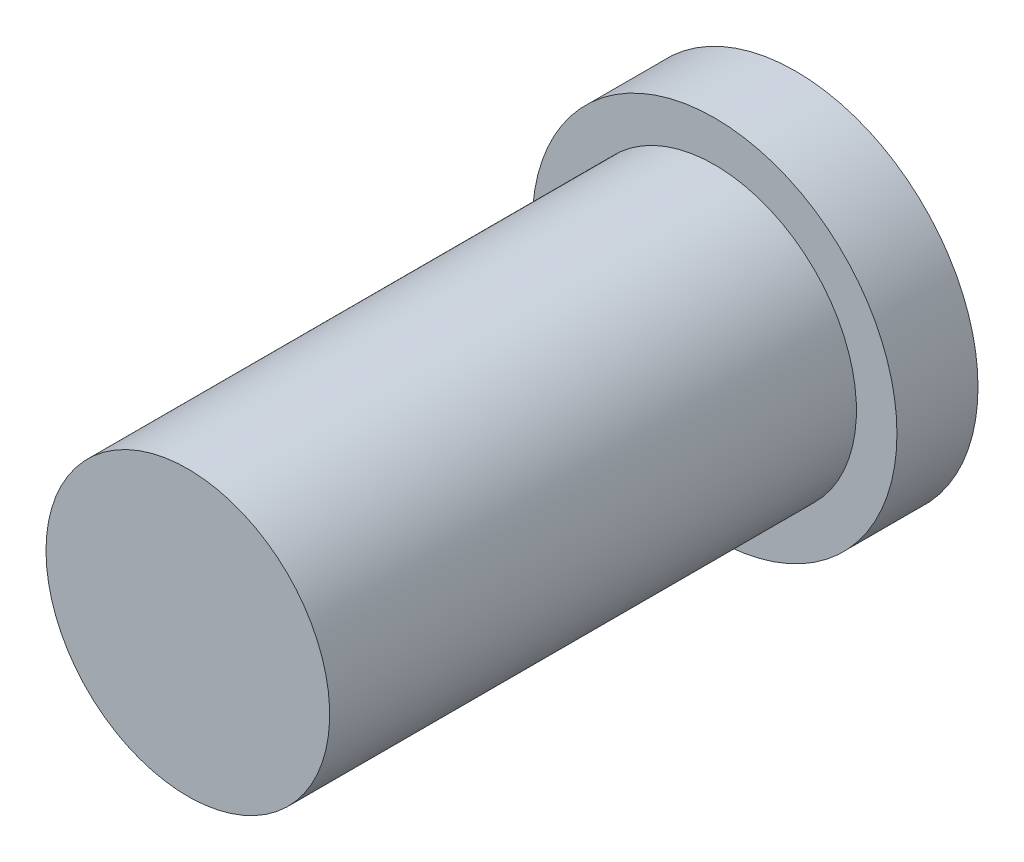
ISO-10303-21;
HEADER;
FILE_DESCRIPTION(('STEP AP214'),'2;1');
FILE_NAME('part.step','',(''),(''),'','','');
FILE_SCHEMA(('AUTOMOTIVE_DESIGN { 1 0 10303 214 1 1 1 1 }'));
ENDSEC;
DATA;
#1=APPLICATION_CONTEXT('core data for automotive mechanical design processes');
#2=APPLICATION_PROTOCOL_DEFINITION('international standard','automotive_design',2000,#1);
#3=PRODUCT_CONTEXT('',#1,'mechanical');
#4=PRODUCT('Part','Part','',(#3));
#5=PRODUCT_RELATED_PRODUCT_CATEGORY('part','',(#4));
#6=PRODUCT_DEFINITION_FORMATION('','',#4);
#7=PRODUCT_DEFINITION_CONTEXT('part definition',#1,'design');
#8=PRODUCT_DEFINITION('design','',#6,#7);
#9=PRODUCT_DEFINITION_SHAPE('','',#8);
#10=(LENGTH_UNIT() NAMED_UNIT(*) SI_UNIT(.MILLI.,.METRE.));
#11=(NAMED_UNIT(*) PLANE_ANGLE_UNIT() SI_UNIT($,.RADIAN.));
#12=(NAMED_UNIT(*) SI_UNIT($,.STERADIAN.) SOLID_ANGLE_UNIT());
#13=UNCERTAINTY_MEASURE_WITH_UNIT(LENGTH_MEASURE(1.E-05),#10,'distance_accuracy_value','');
#14=(GEOMETRIC_REPRESENTATION_CONTEXT(3) GLOBAL_UNCERTAINTY_ASSIGNED_CONTEXT((#13)) GLOBAL_UNIT_ASSIGNED_CONTEXT((#10,
#11,#12)) REPRESENTATION_CONTEXT('',''));
#15=CARTESIAN_POINT('',(0.,0.,0.));
#16=DIRECTION('',(0.,0.,1.));
#17=DIRECTION('',(1.,0.,0.));
#18=AXIS2_PLACEMENT_3D('',#15,#16,#17);
#19=CARTESIAN_POINT('',(0.,0.,2.));
#20=DIRECTION('',(0.,0.,-1.));
#21=DIRECTION('',(-1.,0.,0.));
#22=AXIS2_PLACEMENT_3D('',#19,#20,#21);
#23=CYLINDRICAL_SURFACE('',#22,4.5);
#24=CARTESIAN_POINT('',(0.,0.,2.));
#25=DIRECTION('',(0.,0.,1.));
#26=DIRECTION('',(1.,0.,0.));
#27=AXIS2_PLACEMENT_3D('',#24,#25,#26);
#28=CIRCLE('',#27,4.5);
#29=CARTESIAN_POINT('',(4.5,0.,2.));
#30=VERTEX_POINT('',#29);
#31=EDGE_CURVE('E45',#30,#30,#28,.T.);
#32=ORIENTED_EDGE('',*,*,#31,.F.);
#33=EDGE_LOOP('',(#32));
#34=FACE_BOUND('',#33,.T.);
#35=CARTESIAN_POINT('',(0.,0.,0.));
#36=DIRECTION('',(0.,0.,1.));
#37=DIRECTION('',(1.,0.,0.));
#38=AXIS2_PLACEMENT_3D('',#35,#36,#37);
#39=CIRCLE('',#38,4.5);
#40=CARTESIAN_POINT('',(4.5,0.,0.));
#41=VERTEX_POINT('',#40);
#42=EDGE_CURVE('E40',#41,#41,#39,.T.);
#43=ORIENTED_EDGE('',*,*,#42,.T.);
#44=EDGE_LOOP('',(#43));
#45=FACE_BOUND('',#44,.T.);
#46=ADVANCED_FACE('F37',(#34,#45),#23,.T.);
#47=CARTESIAN_POINT('',(0.,0.,2.));
#48=DIRECTION('',(0.,0.,1.));
#49=DIRECTION('',(1.,0.,0.));
#50=AXIS2_PLACEMENT_3D('',#47,#48,#49);
#51=PLANE('',#50);
#52=CARTESIAN_POINT('',(0.,0.,2.));
#53=DIRECTION('',(0.,0.,1.));
#54=DIRECTION('',(1.,0.,0.));
#55=AXIS2_PLACEMENT_3D('',#52,#53,#54);
#56=CIRCLE('',#55,3.5);
#57=CARTESIAN_POINT('',(-3.5,0.,2.));
#58=VERTEX_POINT('',#57);
#59=EDGE_CURVE('E10',#58,#58,#56,.T.);
#60=ORIENTED_EDGE('',*,*,#59,.F.);
#61=EDGE_LOOP('',(#60));
#62=FACE_BOUND('',#61,.T.);
#63=ORIENTED_EDGE('',*,*,#31,.T.);
#64=EDGE_LOOP('',(#63));
#65=FACE_BOUND('',#64,.T.);
#66=ADVANCED_FACE('F65',(#62,#65),#51,.T.);
#67=CARTESIAN_POINT('',(0.,0.,0.));
#68=DIRECTION('',(0.,0.,1.));
#69=DIRECTION('',(1.,0.,0.));
#70=AXIS2_PLACEMENT_3D('',#67,#68,#69);
#71=PLANE('',#70);
#72=ORIENTED_EDGE('',*,*,#42,.F.);
#73=EDGE_LOOP('',(#72));
#74=FACE_BOUND('',#73,.T.);
#75=ADVANCED_FACE('F62',(#74),#71,.F.);
#76=CARTESIAN_POINT('',(0.,0.,15.));
#77=DIRECTION('',(0.,0.,-1.));
#78=DIRECTION('',(-1.,0.,0.));
#79=AXIS2_PLACEMENT_3D('',#76,#77,#78);
#80=CYLINDRICAL_SURFACE('',#79,3.5);
#81=CARTESIAN_POINT('',(0.,0.,15.));
#82=DIRECTION('',(0.,0.,1.));
#83=DIRECTION('',(1.,0.,0.));
#84=AXIS2_PLACEMENT_3D('',#81,#82,#83);
#85=CIRCLE('',#84,3.5);
#86=CARTESIAN_POINT('',(-3.5,0.,15.));
#87=VERTEX_POINT('',#86);
#88=EDGE_CURVE('E52',#87,#87,#85,.T.);
#89=CARTESIAN_POINT('',(-3.5,0.,15.));
#90=CARTESIAN_POINT('',(-3.5,0.,14.8645833333333));
#91=CARTESIAN_POINT('',(-3.5,0.,14.7291666666667));
#92=CARTESIAN_POINT('',(-3.5,0.,14.4583333333333));
#93=CARTESIAN_POINT('',(-3.5,0.,14.3229166666667));
#94=CARTESIAN_POINT('',(-3.5,0.,14.0520833333333));
#95=CARTESIAN_POINT('',(-3.5,0.,13.9166666666667));
#96=CARTESIAN_POINT('',(-3.5,0.,13.6458333333333));
#97=CARTESIAN_POINT('',(-3.5,0.,13.5104166666667));
#98=CARTESIAN_POINT('',(-3.5,0.,13.2395833333333));
#99=CARTESIAN_POINT('',(-3.5,0.,13.1041666666667));
#100=CARTESIAN_POINT('',(-3.5,0.,12.8333333333333));
#101=CARTESIAN_POINT('',(-3.5,0.,12.6979166666667));
#102=CARTESIAN_POINT('',(-3.5,0.,12.4270833333333));
#103=CARTESIAN_POINT('',(-3.5,0.,12.2916666666667));
#104=CARTESIAN_POINT('',(-3.5,0.,12.0208333333333));
#105=CARTESIAN_POINT('',(-3.5,0.,11.8854166666667));
#106=CARTESIAN_POINT('',(-3.5,0.,11.6145833333333));
#107=CARTESIAN_POINT('',(-3.5,0.,11.4791666666667));
#108=CARTESIAN_POINT('',(-3.5,0.,11.2083333333333));
#109=CARTESIAN_POINT('',(-3.5,0.,11.0729166666667));
#110=CARTESIAN_POINT('',(-3.5,0.,10.8020833333333));
#111=CARTESIAN_POINT('',(-3.5,0.,10.6666666666667));
#112=CARTESIAN_POINT('',(-3.5,0.,10.3958333333333));
#113=CARTESIAN_POINT('',(-3.5,0.,10.2604166666667));
#114=CARTESIAN_POINT('',(-3.5,0.,9.98958333333333));
#115=CARTESIAN_POINT('',(-3.5,0.,9.85416666666667));
#116=CARTESIAN_POINT('',(-3.5,0.,9.58333333333333));
#117=CARTESIAN_POINT('',(-3.5,0.,9.44791666666667));
#118=CARTESIAN_POINT('',(-3.5,0.,9.17708333333333));
#119=CARTESIAN_POINT('',(-3.5,0.,9.04166666666667));
#120=CARTESIAN_POINT('',(-3.5,0.,8.77083333333333));
#121=CARTESIAN_POINT('',(-3.5,0.,8.63541666666667));
#122=CARTESIAN_POINT('',(-3.5,0.,8.36458333333333));
#123=CARTESIAN_POINT('',(-3.5,0.,8.22916666666667));
#124=CARTESIAN_POINT('',(-3.5,0.,7.95833333333333));
#125=CARTESIAN_POINT('',(-3.5,0.,7.82291666666667));
#126=CARTESIAN_POINT('',(-3.5,0.,7.55208333333333));
#127=CARTESIAN_POINT('',(-3.5,0.,7.41666666666667));
#128=CARTESIAN_POINT('',(-3.5,0.,7.14583333333333));
#129=CARTESIAN_POINT('',(-3.5,0.,7.01041666666667));
#130=CARTESIAN_POINT('',(-3.5,0.,6.73958333333333));
#131=CARTESIAN_POINT('',(-3.5,0.,6.60416666666667));
#132=CARTESIAN_POINT('',(-3.5,0.,6.33333333333333));
#133=CARTESIAN_POINT('',(-3.5,0.,6.19791666666667));
#134=CARTESIAN_POINT('',(-3.5,0.,5.92708333333333));
#135=CARTESIAN_POINT('',(-3.5,0.,5.79166666666667));
#136=CARTESIAN_POINT('',(-3.5,0.,5.52083333333333));
#137=CARTESIAN_POINT('',(-3.5,0.,5.38541666666667));
#138=CARTESIAN_POINT('',(-3.5,0.,5.11458333333333));
#139=CARTESIAN_POINT('',(-3.5,0.,4.97916666666667));
#140=CARTESIAN_POINT('',(-3.5,0.,4.70833333333333));
#141=CARTESIAN_POINT('',(-3.5,0.,4.57291666666667));
#142=CARTESIAN_POINT('',(-3.5,0.,4.30208333333333));
#143=CARTESIAN_POINT('',(-3.5,0.,4.16666666666667));
#144=CARTESIAN_POINT('',(-3.5,0.,3.89583333333333));
#145=CARTESIAN_POINT('',(-3.5,0.,3.76041666666667));
#146=CARTESIAN_POINT('',(-3.5,0.,3.48958333333333));
#147=CARTESIAN_POINT('',(-3.5,0.,3.35416666666667));
#148=CARTESIAN_POINT('',(-3.5,0.,3.08333333333333));
#149=CARTESIAN_POINT('',(-3.5,0.,2.94791666666667));
#150=CARTESIAN_POINT('',(-3.5,0.,2.67708333333333));
#151=CARTESIAN_POINT('',(-3.5,0.,2.54166666666667));
#152=CARTESIAN_POINT('',(-3.5,0.,2.27083333333333));
#153=CARTESIAN_POINT('',(-3.5,0.,2.13541666666667));
#154=CARTESIAN_POINT('',(-3.5,0.,2.));
#155=B_SPLINE_CURVE_WITH_KNOTS('',3,(#89,#90,#91,#92,#93,#94,#95,#96,#97,#98,#99,#100,#101,#102,
#103,#104,#105,#106,#107,#108,#109,#110,#111,#112,#113,#114,#115,#116,#117,#118,#119,#120,#121,
#122,#123,#124,#125,#126,#127,#128,#129,#130,#131,#132,#133,#134,#135,#136,#137,#138,#139,#140,
#141,#142,#143,#144,#145,#146,#147,#148,#149,#150,#151,#152,#153,#154),.UNSPECIFIED.,.F.,.F.,(4,
2,2,2,2,2,2,2,2,2,2,2,2,2,2,2,2,2,2,2,2,2,2,2,2,2,2,2,2,2,2,2,4),(0.,0.406249999999999,
0.812499999999999,1.21875,1.625,2.03125,2.4375,2.84375,3.25,3.65625,4.0625,4.46875,4.875,
5.28125,5.6875,6.09375,6.5,6.90625,7.3125,7.71875,8.125,8.53125,8.9375,9.34375,9.75,10.15625,
10.5625,10.96875,11.375,11.78125,12.1875,12.59375,13.),.UNSPECIFIED.);
#156=EDGE_CURVE('BSEAM64',#87,#58,#155,.T.);
#157=ORIENTED_EDGE('',*,*,#88,.F.);
#158=ORIENTED_EDGE('',*,*,#59,.T.);
#159=ORIENTED_EDGE('',*,*,#156,.T.);
#160=ORIENTED_EDGE('',*,*,#156,.F.);
#161=EDGE_LOOP('',(#157,#159,#158,#160));
#162=FACE_BOUND('',#161,.T.);
#163=ADVANCED_FACE('F64',(#162),#80,.T.);
#164=CARTESIAN_POINT('',(0.,0.,15.));
#165=DIRECTION('',(0.,0.,1.));
#166=DIRECTION('',(1.,0.,0.));
#167=AXIS2_PLACEMENT_3D('',#164,#165,#166);
#168=PLANE('',#167);
#169=ORIENTED_EDGE('',*,*,#88,.T.);
#170=EDGE_LOOP('',(#169));
#171=FACE_BOUND('',#170,.T.);
#172=ADVANCED_FACE('F70',(#171),#168,.T.);
#173=CLOSED_SHELL('',(#46,#66,#75,#163,#172));
#174=MANIFOLD_SOLID_BREP('B2',#173);
#175=ADVANCED_BREP_SHAPE_REPRESENTATION('',(#18,#174),#14);
#176=SHAPE_DEFINITION_REPRESENTATION(#9,#175);
ENDSEC;
END-ISO-10303-21;
